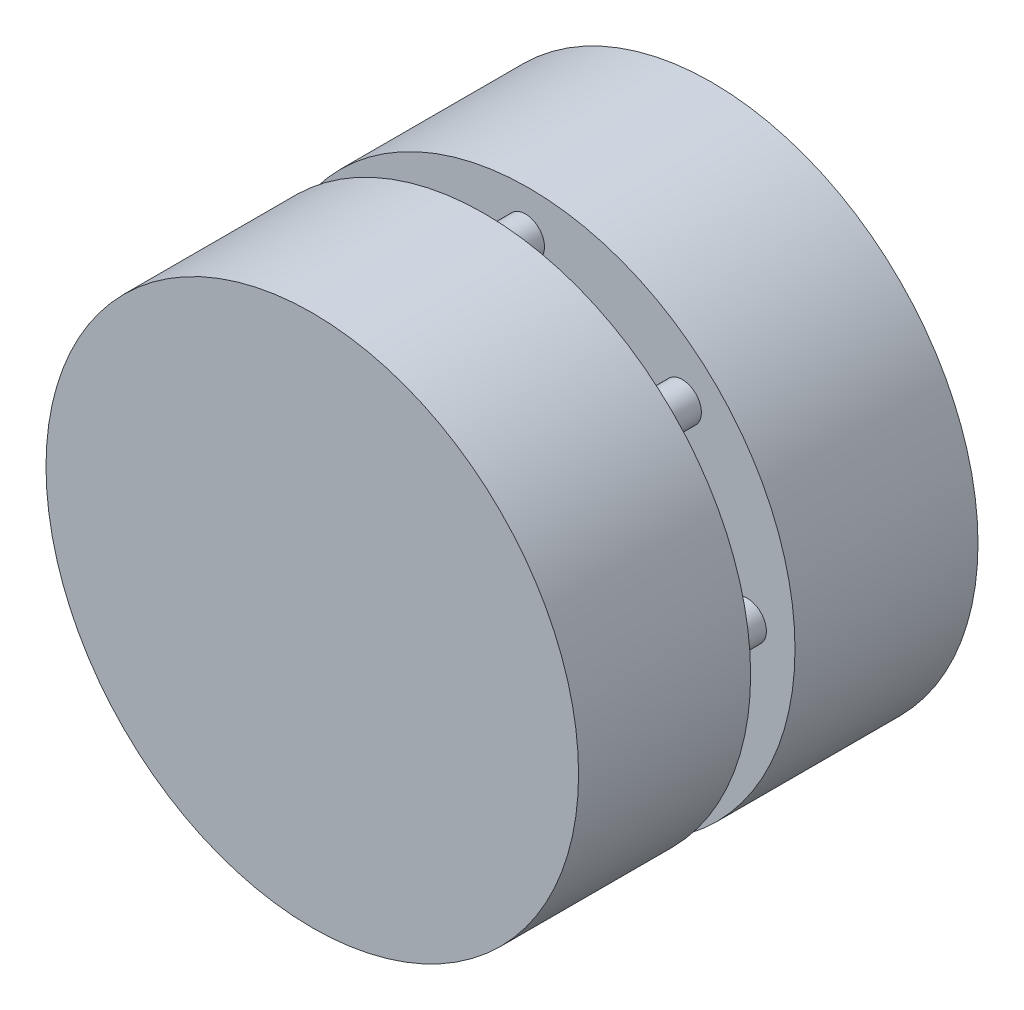
ISO-10303-21;
HEADER;
FILE_DESCRIPTION(('STEP AP214'),'2;1');
FILE_NAME('part.step','',(''),(''),'','','');
FILE_SCHEMA(('AUTOMOTIVE_DESIGN { 1 0 10303 214 1 1 1 1 }'));
ENDSEC;
DATA;
#1=APPLICATION_CONTEXT('core data for automotive mechanical design processes');
#2=APPLICATION_PROTOCOL_DEFINITION('international standard','automotive_design',2000,#1);
#3=PRODUCT_CONTEXT('',#1,'mechanical');
#4=PRODUCT('Part','Part','',(#3));
#5=PRODUCT_RELATED_PRODUCT_CATEGORY('part','',(#4));
#6=PRODUCT_DEFINITION_FORMATION('','',#4);
#7=PRODUCT_DEFINITION_CONTEXT('part definition',#1,'design');
#8=PRODUCT_DEFINITION('design','',#6,#7);
#9=PRODUCT_DEFINITION_SHAPE('','',#8);
#10=(LENGTH_UNIT() NAMED_UNIT(*) SI_UNIT(.MILLI.,.METRE.));
#11=(NAMED_UNIT(*) PLANE_ANGLE_UNIT() SI_UNIT($,.RADIAN.));
#12=(NAMED_UNIT(*) SI_UNIT($,.STERADIAN.) SOLID_ANGLE_UNIT());
#13=UNCERTAINTY_MEASURE_WITH_UNIT(LENGTH_MEASURE(1.E-05),#10,'distance_accuracy_value','');
#14=(GEOMETRIC_REPRESENTATION_CONTEXT(3) GLOBAL_UNCERTAINTY_ASSIGNED_CONTEXT((#13)) GLOBAL_UNIT_ASSIGNED_CONTEXT((#10,
#11,#12)) REPRESENTATION_CONTEXT('',''));
#15=CARTESIAN_POINT('',(0.,0.,0.));
#16=DIRECTION('',(0.,0.,1.));
#17=DIRECTION('',(1.,0.,0.));
#18=AXIS2_PLACEMENT_3D('',#15,#16,#17);
#19=CARTESIAN_POINT('',(0.371495889634384,-0.127231850121227,-23.8758825257781));
#20=DIRECTION('',(0.,0.,-1.));
#21=DIRECTION('',(-1.,0.,0.));
#22=AXIS2_PLACEMENT_3D('',#19,#20,#21);
#23=CYLINDRICAL_SURFACE('',#22,30.);
#24=CARTESIAN_POINT('',(0.371495889634384,-0.127231850121227,-48.2587693794276));
#25=DIRECTION('',(0.,0.,-1.));
#26=DIRECTION('',(-1.,0.,0.));
#27=AXIS2_PLACEMENT_3D('',#24,#25,#26);
#28=CIRCLE('',#27,30.);
#29=CARTESIAN_POINT('',(-29.6285041103656,-0.127231850121227,-48.2587693794276));
#30=VERTEX_POINT('',#29);
#31=EDGE_CURVE('E46',#30,#30,#28,.T.);
#32=CARTESIAN_POINT('',(0.371495889634384,-0.127231850121227,-68.8758825257781));
#33=DIRECTION('',(0.,0.,1.));
#34=DIRECTION('',(1.,0.,0.));
#35=AXIS2_PLACEMENT_3D('',#32,#33,#34);
#36=CIRCLE('',#35,30.);
#37=CARTESIAN_POINT('',(-29.6285041103656,-0.127231850121227,-68.8758825257781));
#38=VERTEX_POINT('',#37);
#39=EDGE_CURVE('E53',#38,#38,#36,.T.);
#40=CARTESIAN_POINT('',(-29.6285041103656,-0.127231850121227,-48.2587693794276));
#41=CARTESIAN_POINT('',(-29.6285041103656,-0.127231850121227,-48.4735309747021));
#42=CARTESIAN_POINT('',(-29.6285041103656,-0.127231850121227,-48.6882925699766));
#43=CARTESIAN_POINT('',(-29.6285041103656,-0.127231850121227,-49.1178157605255));
#44=CARTESIAN_POINT('',(-29.6285041103656,-0.127231850121227,-49.3325773558));
#45=CARTESIAN_POINT('',(-29.6285041103656,-0.127231850121227,-49.762100546349));
#46=CARTESIAN_POINT('',(-29.6285041103656,-0.127231850121227,-49.9768621416235));
#47=CARTESIAN_POINT('',(-29.6285041103656,-0.127231850121227,-50.4063853321724));
#48=CARTESIAN_POINT('',(-29.6285041103656,-0.127231850121227,-50.6211469274469));
#49=CARTESIAN_POINT('',(-29.6285041103656,-0.127231850121227,-51.0506701179959));
#50=CARTESIAN_POINT('',(-29.6285041103656,-0.127231850121227,-51.2654317132704));
#51=CARTESIAN_POINT('',(-29.6285041103656,-0.127231850121227,-51.6949549038194));
#52=CARTESIAN_POINT('',(-29.6285041103656,-0.127231850121227,-51.9097164990938));
#53=CARTESIAN_POINT('',(-29.6285041103656,-0.127231850121227,-52.3392396896428));
#54=CARTESIAN_POINT('',(-29.6285041103656,-0.127231850121227,-52.5540012849173));
#55=CARTESIAN_POINT('',(-29.6285041103656,-0.127231850121227,-52.9835244754663));
#56=CARTESIAN_POINT('',(-29.6285041103656,-0.127231850121227,-53.1982860707407));
#57=CARTESIAN_POINT('',(-29.6285041103656,-0.127231850121227,-53.6278092612897));
#58=CARTESIAN_POINT('',(-29.6285041103656,-0.127231850121227,-53.8425708565642));
#59=CARTESIAN_POINT('',(-29.6285041103656,-0.127231850121227,-54.2720940471132));
#60=CARTESIAN_POINT('',(-29.6285041103656,-0.127231850121227,-54.4868556423877));
#61=CARTESIAN_POINT('',(-29.6285041103656,-0.127231850121227,-54.9163788329366));
#62=CARTESIAN_POINT('',(-29.6285041103656,-0.127231850121227,-55.1311404282111));
#63=CARTESIAN_POINT('',(-29.6285041103656,-0.127231850121227,-55.5606636187601));
#64=CARTESIAN_POINT('',(-29.6285041103656,-0.127231850121227,-55.7754252140346));
#65=CARTESIAN_POINT('',(-29.6285041103656,-0.127231850121227,-56.2049484045835));
#66=CARTESIAN_POINT('',(-29.6285041103656,-0.127231850121227,-56.419709999858));
#67=CARTESIAN_POINT('',(-29.6285041103656,-0.127231850121227,-56.849233190407));
#68=CARTESIAN_POINT('',(-29.6285041103656,-0.127231850121227,-57.0639947856815));
#69=CARTESIAN_POINT('',(-29.6285041103656,-0.127231850121227,-57.4935179762304));
#70=CARTESIAN_POINT('',(-29.6285041103656,-0.127231850121227,-57.7082795715049));
#71=CARTESIAN_POINT('',(-29.6285041103656,-0.127231850121227,-58.1378027620539));
#72=CARTESIAN_POINT('',(-29.6285041103656,-0.127231850121227,-58.3525643573284));
#73=CARTESIAN_POINT('',(-29.6285041103656,-0.127231850121227,-58.7820875478774));
#74=CARTESIAN_POINT('',(-29.6285041103656,-0.127231850121227,-58.9968491431518));
#75=CARTESIAN_POINT('',(-29.6285041103656,-0.127231850121227,-59.4263723337008));
#76=CARTESIAN_POINT('',(-29.6285041103656,-0.127231850121227,-59.6411339289753));
#77=CARTESIAN_POINT('',(-29.6285041103656,-0.127231850121227,-60.0706571195243));
#78=CARTESIAN_POINT('',(-29.6285041103656,-0.127231850121227,-60.2854187147988));
#79=CARTESIAN_POINT('',(-29.6285041103656,-0.127231850121227,-60.7149419053477));
#80=CARTESIAN_POINT('',(-29.6285041103656,-0.127231850121227,-60.9297035006222));
#81=CARTESIAN_POINT('',(-29.6285041103656,-0.127231850121227,-61.3592266911712));
#82=CARTESIAN_POINT('',(-29.6285041103656,-0.127231850121227,-61.5739882864457));
#83=CARTESIAN_POINT('',(-29.6285041103656,-0.127231850121227,-62.0035114769946));
#84=CARTESIAN_POINT('',(-29.6285041103656,-0.127231850121227,-62.2182730722691));
#85=CARTESIAN_POINT('',(-29.6285041103656,-0.127231850121227,-62.6477962628181));
#86=CARTESIAN_POINT('',(-29.6285041103656,-0.127231850121227,-62.8625578580926));
#87=CARTESIAN_POINT('',(-29.6285041103656,-0.127231850121227,-63.2920810486415));
#88=CARTESIAN_POINT('',(-29.6285041103656,-0.127231850121227,-63.506842643916));
#89=CARTESIAN_POINT('',(-29.6285041103656,-0.127231850121227,-63.936365834465));
#90=CARTESIAN_POINT('',(-29.6285041103656,-0.127231850121227,-64.1511274297395));
#91=CARTESIAN_POINT('',(-29.6285041103656,-0.127231850121227,-64.5806506202885));
#92=CARTESIAN_POINT('',(-29.6285041103656,-0.127231850121227,-64.7954122155629));
#93=CARTESIAN_POINT('',(-29.6285041103656,-0.127231850121227,-65.2249354061119));
#94=CARTESIAN_POINT('',(-29.6285041103656,-0.127231850121227,-65.4396970013864));
#95=CARTESIAN_POINT('',(-29.6285041103656,-0.127231850121227,-65.8692201919354));
#96=CARTESIAN_POINT('',(-29.6285041103656,-0.127231850121227,-66.0839817872099));
#97=CARTESIAN_POINT('',(-29.6285041103656,-0.127231850121227,-66.5135049777588));
#98=CARTESIAN_POINT('',(-29.6285041103656,-0.127231850121227,-66.7282665730333));
#99=CARTESIAN_POINT('',(-29.6285041103656,-0.127231850121227,-67.1577897635823));
#100=CARTESIAN_POINT('',(-29.6285041103656,-0.127231850121227,-67.3725513588568));
#101=CARTESIAN_POINT('',(-29.6285041103656,-0.127231850121227,-67.8020745494057));
#102=CARTESIAN_POINT('',(-29.6285041103656,-0.127231850121227,-68.0168361446802));
#103=CARTESIAN_POINT('',(-29.6285041103656,-0.127231850121227,-68.4463593352292));
#104=CARTESIAN_POINT('',(-29.6285041103656,-0.127231850121227,-68.6611209305037));
#105=CARTESIAN_POINT('',(-29.6285041103656,-0.127231850121227,-68.8758825257781));
#106=B_SPLINE_CURVE_WITH_KNOTS('',3,(#40,#41,#42,#43,#44,#45,#46,#47,#48,#49,#50,#51,#52,#53,
#54,#55,#56,#57,#58,#59,#60,#61,#62,#63,#64,#65,#66,#67,#68,#69,#70,#71,#72,#73,#74,#75,#76,#77,
#78,#79,#80,#81,#82,#83,#84,#85,#86,#87,#88,#89,#90,#91,#92,#93,#94,#95,#96,#97,#98,#99,#100,
#101,#102,#103,#104,#105),.UNSPECIFIED.,.F.,.F.,(4,2,2,2,2,2,2,2,2,2,2,2,2,2,2,2,2,2,2,2,2,2,2,
2,2,2,2,2,2,2,2,2,4),(0.,0.644284785823457,1.28856957164691,1.93285435747037,2.57713914329383,
3.22142392911728,3.86570871494073,4.50999350076418,5.15427828658764,5.7985630724111,
6.44284785823455,7.087132644058,7.73141742988146,8.37570221570491,9.01998700152837,
9.66427178735182,10.3085565731753,10.9528413589987,11.5971261448222,12.2414109306456,
12.8856957164691,13.5299805022926,14.174265288116,14.8185500739395,15.4628348597629,
16.1071196455864,16.7514044314098,17.3956892172333,18.0399740030567,18.6842587888802,
19.3285435747036,19.9728283605271,20.6171131463505),.UNSPECIFIED.);
#107=EDGE_CURVE('BSEAM42',#30,#38,#106,.T.);
#108=ORIENTED_EDGE('',*,*,#31,.T.);
#109=ORIENTED_EDGE('',*,*,#39,.T.);
#110=ORIENTED_EDGE('',*,*,#107,.T.);
#111=ORIENTED_EDGE('',*,*,#107,.F.);
#112=EDGE_LOOP('',(#108,#110,#109,#111));
#113=FACE_BOUND('',#112,.T.);
#114=ADVANCED_FACE('F42',(#113),#23,.T.);
#115=CARTESIAN_POINT('',(0.371495889634384,-0.127231850121227,-68.8758825257781));
#116=DIRECTION('',(0.,0.,1.));
#117=DIRECTION('',(1.,0.,0.));
#118=AXIS2_PLACEMENT_3D('',#115,#116,#117);
#119=PLANE('',#118);
#120=ORIENTED_EDGE('',*,*,#39,.F.);
#121=EDGE_LOOP('',(#120));
#122=FACE_BOUND('',#121,.T.);
#123=ADVANCED_FACE('F194',(#122),#119,.F.);
#124=CARTESIAN_POINT('',(-42.15,-19.7589338943235,-48.2587693794276));
#125=DIRECTION('',(0.,0.,-1.));
#126=DIRECTION('',(0.,-1.,0.));
#127=AXIS2_PLACEMENT_3D('',#124,#125,#126);
#128=PLANE('',#127);
#129=CARTESIAN_POINT('',(0.,0.,-48.2587693794276));
#130=DIRECTION('',(0.,0.,-1.));
#131=DIRECTION('',(-1.,0.,0.));
#132=AXIS2_PLACEMENT_3D('',#129,#130,#131);
#133=CIRCLE('',#132,20.);
#134=CARTESIAN_POINT('',(-20.,0.,-48.2587693794276));
#135=VERTEX_POINT('',#134);
#136=EDGE_CURVE('E155',#135,#135,#133,.T.);
#137=ORIENTED_EDGE('',*,*,#136,.T.);
#138=EDGE_LOOP('',(#137));
#139=FACE_BOUND('',#138,.T.);
#140=CARTESIAN_POINT('',(0.,-25.,-48.2587693794276));
#141=DIRECTION('',(0.,0.,-1.));
#142=DIRECTION('',(-1.,0.,0.));
#143=AXIS2_PLACEMENT_3D('',#140,#141,#142);
#144=CIRCLE('',#143,2.15);
#145=CARTESIAN_POINT('',(-2.15,-25.,-48.2587693794276));
#146=VERTEX_POINT('',#145);
#147=EDGE_CURVE('E146',#146,#146,#144,.T.);
#148=ORIENTED_EDGE('',*,*,#147,.T.);
#149=EDGE_LOOP('',(#148));
#150=FACE_BOUND('',#149,.T.);
#151=CARTESIAN_POINT('',(-17.6776695296637,-17.6776695296637,-48.2587693794276));
#152=DIRECTION('',(0.,0.,-1.));
#153=DIRECTION('',(-1.,0.,0.));
#154=AXIS2_PLACEMENT_3D('',#151,#152,#153);
#155=CIRCLE('',#154,2.15);
#156=CARTESIAN_POINT('',(-19.8276695296637,-17.6776695296637,-48.2587693794276));
#157=VERTEX_POINT('',#156);
#158=EDGE_CURVE('E142',#157,#157,#155,.T.);
#159=ORIENTED_EDGE('',*,*,#158,.T.);
#160=EDGE_LOOP('',(#159));
#161=FACE_BOUND('',#160,.T.);
#162=CARTESIAN_POINT('',(-25.,0.,-48.2587693794276));
#163=DIRECTION('',(0.,0.,-1.));
#164=DIRECTION('',(-1.,0.,0.));
#165=AXIS2_PLACEMENT_3D('',#162,#163,#164);
#166=CIRCLE('',#165,2.15);
#167=CARTESIAN_POINT('',(-27.15,0.,-48.2587693794276));
#168=VERTEX_POINT('',#167);
#169=EDGE_CURVE('E145',#168,#168,#166,.T.);
#170=ORIENTED_EDGE('',*,*,#169,.T.);
#171=EDGE_LOOP('',(#170));
#172=FACE_BOUND('',#171,.T.);
#173=CARTESIAN_POINT('',(-17.6776695296637,17.6776695296637,-48.2587693794276));
#174=DIRECTION('',(0.,0.,-1.));
#175=DIRECTION('',(-1.,0.,0.));
#176=AXIS2_PLACEMENT_3D('',#173,#174,#175);
#177=CIRCLE('',#176,2.15);
#178=CARTESIAN_POINT('',(-19.8276695296637,17.6776695296637,-48.2587693794276));
#179=VERTEX_POINT('',#178);
#180=EDGE_CURVE('E150',#179,#179,#177,.T.);
#181=ORIENTED_EDGE('',*,*,#180,.T.);
#182=EDGE_LOOP('',(#181));
#183=FACE_BOUND('',#182,.T.);
#184=CARTESIAN_POINT('',(0.,25.,-48.2587693794276));
#185=DIRECTION('',(0.,0.,-1.));
#186=DIRECTION('',(-1.,0.,0.));
#187=AXIS2_PLACEMENT_3D('',#184,#185,#186);
#188=CIRCLE('',#187,2.15);
#189=CARTESIAN_POINT('',(-2.15,25.,-48.2587693794276));
#190=VERTEX_POINT('',#189);
#191=EDGE_CURVE('E159',#190,#190,#188,.T.);
#192=ORIENTED_EDGE('',*,*,#191,.T.);
#193=EDGE_LOOP('',(#192));
#194=FACE_BOUND('',#193,.T.);
#195=CARTESIAN_POINT('',(17.6776695296637,17.6776695296637,-48.2587693794276));
#196=DIRECTION('',(0.,0.,-1.));
#197=DIRECTION('',(-1.,0.,0.));
#198=AXIS2_PLACEMENT_3D('',#195,#196,#197);
#199=CIRCLE('',#198,2.15);
#200=CARTESIAN_POINT('',(15.5276695296637,17.6776695296637,-48.2587693794276));
#201=VERTEX_POINT('',#200);
#202=EDGE_CURVE('E161',#201,#201,#199,.T.);
#203=ORIENTED_EDGE('',*,*,#202,.T.);
#204=EDGE_LOOP('',(#203));
#205=FACE_BOUND('',#204,.T.);
#206=CARTESIAN_POINT('',(25.,0.,-48.2587693794276));
#207=DIRECTION('',(0.,0.,-1.));
#208=DIRECTION('',(-1.,0.,0.));
#209=AXIS2_PLACEMENT_3D('',#206,#207,#208);
#210=CIRCLE('',#209,2.15);
#211=CARTESIAN_POINT('',(22.85,0.,-48.2587693794276));
#212=VERTEX_POINT('',#211);
#213=EDGE_CURVE('E135',#212,#212,#210,.T.);
#214=ORIENTED_EDGE('',*,*,#213,.T.);
#215=EDGE_LOOP('',(#214));
#216=FACE_BOUND('',#215,.T.);
#217=CARTESIAN_POINT('',(17.6776695296637,-17.6776695296637,-48.2587693794276));
#218=DIRECTION('',(0.,0.,-1.));
#219=DIRECTION('',(-1.,0.,0.));
#220=AXIS2_PLACEMENT_3D('',#217,#218,#219);
#221=CIRCLE('',#220,2.15);
#222=CARTESIAN_POINT('',(15.5276695296637,-17.6776695296637,-48.2587693794276));
#223=VERTEX_POINT('',#222);
#224=EDGE_CURVE('E154',#223,#223,#221,.T.);
#225=ORIENTED_EDGE('',*,*,#224,.T.);
#226=EDGE_LOOP('',(#225));
#227=FACE_BOUND('',#226,.T.);
#228=ORIENTED_EDGE('',*,*,#31,.F.);
#229=EDGE_LOOP('',(#228));
#230=FACE_BOUND('',#229,.T.);
#231=ADVANCED_FACE('F191',(#139,#150,#161,#172,#183,#194,#205,#216,#227,#230),#128,.F.);
#232=CARTESIAN_POINT('',(-42.15,7.69572427943987,-43.2587693794276));
#233=DIRECTION('',(0.,0.,1.));
#234=DIRECTION('',(1.,0.,0.));
#235=AXIS2_PLACEMENT_3D('',#232,#233,#234);
#236=PLANE('',#235);
#237=CARTESIAN_POINT('',(0.,0.,-43.2587693794276));
#238=DIRECTION('',(0.,0.,-1.));
#239=DIRECTION('',(1.,0.,0.));
#240=AXIS2_PLACEMENT_3D('',#237,#238,#239);
#241=CIRCLE('',#240,20.5);
#242=CARTESIAN_POINT('',(20.5,0.,-43.2587693794276));
#243=VERTEX_POINT('',#242);
#244=EDGE_CURVE('E131',#243,#243,#241,.T.);
#245=ORIENTED_EDGE('',*,*,#244,.F.);
#246=EDGE_LOOP('',(#245));
#247=FACE_BOUND('',#246,.T.);
#248=CARTESIAN_POINT('',(17.6776695296637,-17.6776695296637,-43.2587693794276));
#249=DIRECTION('',(0.,0.,-1.));
#250=DIRECTION('',(-1.,0.,0.));
#251=AXIS2_PLACEMENT_3D('',#248,#249,#250);
#252=CIRCLE('',#251,2.15);
#253=CARTESIAN_POINT('',(15.5276695296637,-17.6776695296637,-43.2587693794276));
#254=VERTEX_POINT('',#253);
#255=EDGE_CURVE('E124',#254,#254,#252,.T.);
#256=ORIENTED_EDGE('',*,*,#255,.F.);
#257=EDGE_LOOP('',(#256));
#258=FACE_BOUND('',#257,.T.);
#259=CARTESIAN_POINT('',(25.,0.,-43.2587693794276));
#260=DIRECTION('',(0.,0.,-1.));
#261=DIRECTION('',(-1.,0.,0.));
#262=AXIS2_PLACEMENT_3D('',#259,#260,#261);
#263=CIRCLE('',#262,2.15);
#264=CARTESIAN_POINT('',(22.85,0.,-43.2587693794276));
#265=VERTEX_POINT('',#264);
#266=EDGE_CURVE('E119',#265,#265,#263,.T.);
#267=ORIENTED_EDGE('',*,*,#266,.F.);
#268=EDGE_LOOP('',(#267));
#269=FACE_BOUND('',#268,.T.);
#270=CARTESIAN_POINT('',(17.6776695296637,17.6776695296637,-43.2587693794276));
#271=DIRECTION('',(0.,0.,-1.));
#272=DIRECTION('',(-1.,0.,0.));
#273=AXIS2_PLACEMENT_3D('',#270,#271,#272);
#274=CIRCLE('',#273,2.15);
#275=CARTESIAN_POINT('',(15.5276695296637,17.6776695296637,-43.2587693794276));
#276=VERTEX_POINT('',#275);
#277=EDGE_CURVE('E123',#276,#276,#274,.T.);
#278=ORIENTED_EDGE('',*,*,#277,.F.);
#279=EDGE_LOOP('',(#278));
#280=FACE_BOUND('',#279,.T.);
#281=CARTESIAN_POINT('',(0.,25.,-43.2587693794276));
#282=DIRECTION('',(0.,0.,-1.));
#283=DIRECTION('',(-1.,0.,0.));
#284=AXIS2_PLACEMENT_3D('',#281,#282,#283);
#285=CIRCLE('',#284,2.15);
#286=CARTESIAN_POINT('',(-2.15,25.,-43.2587693794276));
#287=VERTEX_POINT('',#286);
#288=EDGE_CURVE('E129',#287,#287,#285,.T.);
#289=ORIENTED_EDGE('',*,*,#288,.F.);
#290=EDGE_LOOP('',(#289));
#291=FACE_BOUND('',#290,.T.);
#292=CARTESIAN_POINT('',(-17.6776695296637,17.6776695296637,-43.2587693794276));
#293=DIRECTION('',(0.,0.,-1.));
#294=DIRECTION('',(-1.,0.,0.));
#295=AXIS2_PLACEMENT_3D('',#292,#293,#294);
#296=CIRCLE('',#295,2.15);
#297=CARTESIAN_POINT('',(-19.8276695296637,17.6776695296637,-43.2587693794276));
#298=VERTEX_POINT('',#297);
#299=EDGE_CURVE('E137',#298,#298,#296,.T.);
#300=ORIENTED_EDGE('',*,*,#299,.F.);
#301=EDGE_LOOP('',(#300));
#302=FACE_BOUND('',#301,.T.);
#303=CARTESIAN_POINT('',(-25.,0.,-43.2587693794276));
#304=DIRECTION('',(0.,0.,-1.));
#305=DIRECTION('',(-1.,0.,0.));
#306=AXIS2_PLACEMENT_3D('',#303,#304,#305);
#307=CIRCLE('',#306,2.15);
#308=CARTESIAN_POINT('',(-27.15,0.,-43.2587693794276));
#309=VERTEX_POINT('',#308);
#310=EDGE_CURVE('E141',#309,#309,#307,.T.);
#311=ORIENTED_EDGE('',*,*,#310,.F.);
#312=EDGE_LOOP('',(#311));
#313=FACE_BOUND('',#312,.T.);
#314=CARTESIAN_POINT('',(-17.6776695296637,-17.6776695296637,-43.2587693794276));
#315=DIRECTION('',(0.,0.,-1.));
#316=DIRECTION('',(-1.,0.,0.));
#317=AXIS2_PLACEMENT_3D('',#314,#315,#316);
#318=CIRCLE('',#317,2.15);
#319=CARTESIAN_POINT('',(-19.8276695296637,-17.6776695296637,-43.2587693794276));
#320=VERTEX_POINT('',#319);
#321=EDGE_CURVE('E166',#320,#320,#318,.T.);
#322=ORIENTED_EDGE('',*,*,#321,.F.);
#323=EDGE_LOOP('',(#322));
#324=FACE_BOUND('',#323,.T.);
#325=CARTESIAN_POINT('',(0.,-25.,-43.2587693794276));
#326=DIRECTION('',(0.,0.,-1.));
#327=DIRECTION('',(-1.,0.,0.));
#328=AXIS2_PLACEMENT_3D('',#325,#326,#327);
#329=CIRCLE('',#328,2.15);
#330=CARTESIAN_POINT('',(-2.15,-25.,-43.2587693794276));
#331=VERTEX_POINT('',#330);
#332=EDGE_CURVE('E157',#331,#331,#329,.T.);
#333=ORIENTED_EDGE('',*,*,#332,.F.);
#334=EDGE_LOOP('',(#333));
#335=FACE_BOUND('',#334,.T.);
#336=CARTESIAN_POINT('',(0.371495889634384,-0.127231850121227,-43.2587693794276));
#337=DIRECTION('',(0.,0.,1.));
#338=DIRECTION('',(1.,0.,0.));
#339=AXIS2_PLACEMENT_3D('',#336,#337,#338);
#340=CIRCLE('',#339,30.);
#341=CARTESIAN_POINT('',(-29.6285041103656,-0.127231850121227,-43.2587693794276));
#342=VERTEX_POINT('',#341);
#343=EDGE_CURVE('E153',#342,#342,#340,.T.);
#344=ORIENTED_EDGE('',*,*,#343,.F.);
#345=EDGE_LOOP('',(#344));
#346=FACE_BOUND('',#345,.T.);
#347=ADVANCED_FACE('F193',(#247,#258,#269,#280,#291,#302,#313,#324,#335,#346),#236,.F.);
#348=CARTESIAN_POINT('',(0.,0.,-43.7587693794276));
#349=DIRECTION('',(0.,0.,1.));
#350=DIRECTION('',(1.,0.,0.));
#351=AXIS2_PLACEMENT_3D('',#348,#349,#350);
#352=TOROIDAL_SURFACE('',#351,20.5,0.5);
#353=ORIENTED_EDGE('',*,*,#244,.T.);
#354=EDGE_LOOP('',(#353));
#355=FACE_BOUND('',#354,.T.);
#356=CARTESIAN_POINT('',(0.,0.,-43.7587693794276));
#357=DIRECTION('',(0.,0.,1.));
#358=DIRECTION('',(1.,0.,0.));
#359=AXIS2_PLACEMENT_3D('',#356,#357,#358);
#360=CIRCLE('',#359,20.);
#361=CARTESIAN_POINT('',(20.,0.,-43.7587693794276));
#362=VERTEX_POINT('',#361);
#363=EDGE_CURVE('E64',#362,#362,#360,.T.);
#364=ORIENTED_EDGE('',*,*,#363,.T.);
#365=EDGE_LOOP('',(#364));
#366=FACE_BOUND('',#365,.T.);
#367=ADVANCED_FACE('F200',(#355,#366),#352,.F.);
#368=CARTESIAN_POINT('',(0.,0.,-43.2587693794276));
#369=DIRECTION('',(0.,0.,-1.));
#370=DIRECTION('',(-1.,0.,0.));
#371=AXIS2_PLACEMENT_3D('',#368,#369,#370);
#372=CYLINDRICAL_SURFACE('',#371,20.);
#373=ORIENTED_EDGE('',*,*,#136,.F.);
#374=EDGE_LOOP('',(#373));
#375=FACE_BOUND('',#374,.T.);
#376=ORIENTED_EDGE('',*,*,#363,.F.);
#377=EDGE_LOOP('',(#376));
#378=FACE_BOUND('',#377,.T.);
#379=ADVANCED_FACE('F236',(#375,#378),#372,.T.);
#380=CARTESIAN_POINT('',(17.6776695296637,-17.6776695296637,-43.2587693794276));
#381=DIRECTION('',(0.,0.,-1.));
#382=DIRECTION('',(-1.,0.,0.));
#383=AXIS2_PLACEMENT_3D('',#380,#381,#382);
#384=CYLINDRICAL_SURFACE('',#383,2.15);
#385=ORIENTED_EDGE('',*,*,#224,.F.);
#386=EDGE_LOOP('',(#385));
#387=FACE_BOUND('',#386,.T.);
#388=ORIENTED_EDGE('',*,*,#255,.T.);
#389=EDGE_LOOP('',(#388));
#390=FACE_BOUND('',#389,.T.);
#391=ADVANCED_FACE('F228',(#387,#390),#384,.T.);
#392=CARTESIAN_POINT('',(25.,0.,-43.2587693794276));
#393=DIRECTION('',(0.,0.,-1.));
#394=DIRECTION('',(-1.,0.,0.));
#395=AXIS2_PLACEMENT_3D('',#392,#393,#394);
#396=CYLINDRICAL_SURFACE('',#395,2.15);
#397=ORIENTED_EDGE('',*,*,#213,.F.);
#398=EDGE_LOOP('',(#397));
#399=FACE_BOUND('',#398,.T.);
#400=ORIENTED_EDGE('',*,*,#266,.T.);
#401=EDGE_LOOP('',(#400));
#402=FACE_BOUND('',#401,.T.);
#403=ADVANCED_FACE('F120',(#399,#402),#396,.T.);
#404=CARTESIAN_POINT('',(17.6776695296637,17.6776695296637,-43.2587693794276));
#405=DIRECTION('',(0.,0.,-1.));
#406=DIRECTION('',(-1.,0.,0.));
#407=AXIS2_PLACEMENT_3D('',#404,#405,#406);
#408=CYLINDRICAL_SURFACE('',#407,2.15);
#409=ORIENTED_EDGE('',*,*,#202,.F.);
#410=EDGE_LOOP('',(#409));
#411=FACE_BOUND('',#410,.T.);
#412=ORIENTED_EDGE('',*,*,#277,.T.);
#413=EDGE_LOOP('',(#412));
#414=FACE_BOUND('',#413,.T.);
#415=ADVANCED_FACE('F227',(#411,#414),#408,.T.);
#416=CARTESIAN_POINT('',(0.,25.,-43.2587693794276));
#417=DIRECTION('',(0.,0.,-1.));
#418=DIRECTION('',(-1.,0.,0.));
#419=AXIS2_PLACEMENT_3D('',#416,#417,#418);
#420=CYLINDRICAL_SURFACE('',#419,2.15);
#421=ORIENTED_EDGE('',*,*,#191,.F.);
#422=EDGE_LOOP('',(#421));
#423=FACE_BOUND('',#422,.T.);
#424=ORIENTED_EDGE('',*,*,#288,.T.);
#425=EDGE_LOOP('',(#424));
#426=FACE_BOUND('',#425,.T.);
#427=ADVANCED_FACE('F232',(#423,#426),#420,.T.);
#428=CARTESIAN_POINT('',(-17.6776695296637,17.6776695296637,-43.2587693794276));
#429=DIRECTION('',(0.,0.,-1.));
#430=DIRECTION('',(-1.,0.,0.));
#431=AXIS2_PLACEMENT_3D('',#428,#429,#430);
#432=CYLINDRICAL_SURFACE('',#431,2.15);
#433=ORIENTED_EDGE('',*,*,#180,.F.);
#434=EDGE_LOOP('',(#433));
#435=FACE_BOUND('',#434,.T.);
#436=ORIENTED_EDGE('',*,*,#299,.T.);
#437=EDGE_LOOP('',(#436));
#438=FACE_BOUND('',#437,.T.);
#439=ADVANCED_FACE('F242',(#435,#438),#432,.T.);
#440=CARTESIAN_POINT('',(-25.,0.,-43.2587693794276));
#441=DIRECTION('',(0.,0.,-1.));
#442=DIRECTION('',(-1.,0.,0.));
#443=AXIS2_PLACEMENT_3D('',#440,#441,#442);
#444=CYLINDRICAL_SURFACE('',#443,2.15);
#445=ORIENTED_EDGE('',*,*,#169,.F.);
#446=EDGE_LOOP('',(#445));
#447=FACE_BOUND('',#446,.T.);
#448=ORIENTED_EDGE('',*,*,#310,.T.);
#449=EDGE_LOOP('',(#448));
#450=FACE_BOUND('',#449,.T.);
#451=ADVANCED_FACE('F240',(#447,#450),#444,.T.);
#452=CARTESIAN_POINT('',(-17.6776695296637,-17.6776695296637,-43.2587693794276));
#453=DIRECTION('',(0.,0.,-1.));
#454=DIRECTION('',(-1.,0.,0.));
#455=AXIS2_PLACEMENT_3D('',#452,#453,#454);
#456=CYLINDRICAL_SURFACE('',#455,2.15);
#457=ORIENTED_EDGE('',*,*,#158,.F.);
#458=EDGE_LOOP('',(#457));
#459=FACE_BOUND('',#458,.T.);
#460=ORIENTED_EDGE('',*,*,#321,.T.);
#461=EDGE_LOOP('',(#460));
#462=FACE_BOUND('',#461,.T.);
#463=ADVANCED_FACE('F221',(#459,#462),#456,.T.);
#464=CARTESIAN_POINT('',(0.,-25.,-43.2587693794276));
#465=DIRECTION('',(0.,0.,-1.));
#466=DIRECTION('',(-1.,0.,0.));
#467=AXIS2_PLACEMENT_3D('',#464,#465,#466);
#468=CYLINDRICAL_SURFACE('',#467,2.15);
#469=ORIENTED_EDGE('',*,*,#147,.F.);
#470=EDGE_LOOP('',(#469));
#471=FACE_BOUND('',#470,.T.);
#472=ORIENTED_EDGE('',*,*,#332,.T.);
#473=EDGE_LOOP('',(#472));
#474=FACE_BOUND('',#473,.T.);
#475=ADVANCED_FACE('F214',(#471,#474),#468,.T.);
#476=CARTESIAN_POINT('',(0.371495889634384,-0.127231850121227,-23.8758825257781));
#477=DIRECTION('',(0.,0.,1.));
#478=DIRECTION('',(1.,0.,0.));
#479=AXIS2_PLACEMENT_3D('',#476,#477,#478);
#480=PLANE('',#479);
#481=CARTESIAN_POINT('',(0.371495889634384,-0.127231850121227,-23.8758825257781));
#482=DIRECTION('',(0.,0.,1.));
#483=DIRECTION('',(1.,0.,0.));
#484=AXIS2_PLACEMENT_3D('',#481,#482,#483);
#485=CIRCLE('',#484,30.);
#486=CARTESIAN_POINT('',(-29.6285041103656,-0.127231850121227,-23.8758825257781));
#487=VERTEX_POINT('',#486);
#488=EDGE_CURVE('E11',#487,#487,#485,.T.);
#489=ORIENTED_EDGE('',*,*,#488,.T.);
#490=EDGE_LOOP('',(#489));
#491=FACE_BOUND('',#490,.T.);
#492=ADVANCED_FACE('F210',(#491),#480,.T.);
#493=CARTESIAN_POINT('',(-29.6285041103656,-0.127231850121227,-43.2587693794276));
#494=CARTESIAN_POINT('',(-29.6285041103656,-0.127231850121227,-43.0568643080354));
#495=CARTESIAN_POINT('',(-29.6285041103656,-0.127231850121227,-42.8549592366432));
#496=CARTESIAN_POINT('',(-29.6285041103656,-0.127231850121227,-42.4511490938589));
#497=CARTESIAN_POINT('',(-29.6285041103656,-0.127231850121227,-42.2492440224667));
#498=CARTESIAN_POINT('',(-29.6285041103656,-0.127231850121227,-41.8454338796823));
#499=CARTESIAN_POINT('',(-29.6285041103656,-0.127231850121227,-41.6435288082901));
#500=CARTESIAN_POINT('',(-29.6285041103656,-0.127231850121227,-41.2397186655058));
#501=CARTESIAN_POINT('',(-29.6285041103656,-0.127231850121227,-41.0378135941136));
#502=CARTESIAN_POINT('',(-29.6285041103656,-0.127231850121227,-40.6340034513292));
#503=CARTESIAN_POINT('',(-29.6285041103656,-0.127231850121227,-40.4320983799371));
#504=CARTESIAN_POINT('',(-29.6285041103656,-0.127231850121227,-40.0282882371527));
#505=CARTESIAN_POINT('',(-29.6285041103656,-0.127231850121227,-39.8263831657605));
#506=CARTESIAN_POINT('',(-29.6285041103656,-0.127231850121227,-39.4225730229762));
#507=CARTESIAN_POINT('',(-29.6285041103656,-0.127231850121227,-39.220667951584));
#508=CARTESIAN_POINT('',(-29.6285041103656,-0.127231850121227,-38.8168578087996));
#509=CARTESIAN_POINT('',(-29.6285041103656,-0.127231850121227,-38.6149527374074));
#510=CARTESIAN_POINT('',(-29.6285041103656,-0.127231850121227,-38.2111425946231));
#511=CARTESIAN_POINT('',(-29.6285041103656,-0.127231850121227,-38.0092375232309));
#512=CARTESIAN_POINT('',(-29.6285041103656,-0.127231850121227,-37.6054273804465));
#513=CARTESIAN_POINT('',(-29.6285041103656,-0.127231850121227,-37.4035223090543));
#514=CARTESIAN_POINT('',(-29.6285041103656,-0.127231850121227,-36.99971216627));
#515=CARTESIAN_POINT('',(-29.6285041103656,-0.127231850121227,-36.7978070948778));
#516=CARTESIAN_POINT('',(-29.6285041103656,-0.127231850121227,-36.3939969520934));
#517=CARTESIAN_POINT('',(-29.6285041103656,-0.127231850121227,-36.1920918807012));
#518=CARTESIAN_POINT('',(-29.6285041103656,-0.127231850121227,-35.7882817379169));
#519=CARTESIAN_POINT('',(-29.6285041103656,-0.127231850121227,-35.5863766665247));
#520=CARTESIAN_POINT('',(-29.6285041103656,-0.127231850121227,-35.1825665237403));
#521=CARTESIAN_POINT('',(-29.6285041103656,-0.127231850121227,-34.9806614523482));
#522=CARTESIAN_POINT('',(-29.6285041103656,-0.127231850121227,-34.5768513095638));
#523=CARTESIAN_POINT('',(-29.6285041103656,-0.127231850121227,-34.3749462381716));
#524=CARTESIAN_POINT('',(-29.6285041103656,-0.127231850121227,-33.9711360953872));
#525=CARTESIAN_POINT('',(-29.6285041103656,-0.127231850121227,-33.7692310239951));
#526=CARTESIAN_POINT('',(-29.6285041103656,-0.127231850121227,-33.3654208812107));
#527=CARTESIAN_POINT('',(-29.6285041103656,-0.127231850121227,-33.1635158098185));
#528=CARTESIAN_POINT('',(-29.6285041103656,-0.127231850121227,-32.7597056670341));
#529=CARTESIAN_POINT('',(-29.6285041103656,-0.127231850121227,-32.557800595642));
#530=CARTESIAN_POINT('',(-29.6285041103656,-0.127231850121227,-32.1539904528576));
#531=CARTESIAN_POINT('',(-29.6285041103656,-0.127231850121227,-31.9520853814654));
#532=CARTESIAN_POINT('',(-29.6285041103656,-0.127231850121227,-31.5482752386811));
#533=CARTESIAN_POINT('',(-29.6285041103656,-0.127231850121227,-31.3463701672889));
#534=CARTESIAN_POINT('',(-29.6285041103656,-0.127231850121227,-30.9425600245045));
#535=CARTESIAN_POINT('',(-29.6285041103656,-0.127231850121227,-30.7406549531123));
#536=CARTESIAN_POINT('',(-29.6285041103656,-0.127231850121227,-30.336844810328));
#537=CARTESIAN_POINT('',(-29.6285041103656,-0.127231850121227,-30.1349397389358));
#538=CARTESIAN_POINT('',(-29.6285041103656,-0.127231850121227,-29.7311295961514));
#539=CARTESIAN_POINT('',(-29.6285041103656,-0.127231850121227,-29.5292245247592));
#540=CARTESIAN_POINT('',(-29.6285041103656,-0.127231850121227,-29.1254143819749));
#541=CARTESIAN_POINT('',(-29.6285041103656,-0.127231850121227,-28.9235093105827));
#542=CARTESIAN_POINT('',(-29.6285041103656,-0.127231850121227,-28.5196991677983));
#543=CARTESIAN_POINT('',(-29.6285041103656,-0.127231850121227,-28.3177940964061));
#544=CARTESIAN_POINT('',(-29.6285041103656,-0.127231850121227,-27.9139839536218));
#545=CARTESIAN_POINT('',(-29.6285041103656,-0.127231850121227,-27.7120788822296));
#546=CARTESIAN_POINT('',(-29.6285041103656,-0.127231850121227,-27.3082687394452));
#547=CARTESIAN_POINT('',(-29.6285041103656,-0.127231850121227,-27.1063636680531));
#548=CARTESIAN_POINT('',(-29.6285041103656,-0.127231850121227,-26.7025535252687));
#549=CARTESIAN_POINT('',(-29.6285041103656,-0.127231850121227,-26.5006484538765));
#550=CARTESIAN_POINT('',(-29.6285041103656,-0.127231850121227,-26.0968383110921));
#551=CARTESIAN_POINT('',(-29.6285041103656,-0.127231850121227,-25.8949332397));
#552=CARTESIAN_POINT('',(-29.6285041103656,-0.127231850121227,-25.4911230969156));
#553=CARTESIAN_POINT('',(-29.6285041103656,-0.127231850121227,-25.2892180255234));
#554=CARTESIAN_POINT('',(-29.6285041103656,-0.127231850121227,-24.8854078827391));
#555=CARTESIAN_POINT('',(-29.6285041103656,-0.127231850121227,-24.6835028113469));
#556=CARTESIAN_POINT('',(-29.6285041103656,-0.127231850121227,-24.2796926685625));
#557=CARTESIAN_POINT('',(-29.6285041103656,-0.127231850121227,-24.0777875971703));
#558=CARTESIAN_POINT('',(-29.6285041103656,-0.127231850121227,-23.8758825257781));
#559=B_SPLINE_CURVE_WITH_KNOTS('',3,(#493,#494,#495,#496,#497,#498,#499,#500,#501,#502,#503,
#504,#505,#506,#507,#508,#509,#510,#511,#512,#513,#514,#515,#516,#517,#518,#519,#520,#521,#522,
#523,#524,#525,#526,#527,#528,#529,#530,#531,#532,#533,#534,#535,#536,#537,#538,#539,#540,#541,
#542,#543,#544,#545,#546,#547,#548,#549,#550,#551,#552,#553,#554,#555,#556,#557,#558),
.UNSPECIFIED.,.F.,.F.,(4,2,2,2,2,2,2,2,2,2,2,2,2,2,2,2,2,2,2,2,2,2,2,2,2,2,2,2,2,2,2,2,4),(0.,
0.605715214176544,1.21143042835309,1.81714564252963,2.42286085670618,3.02857607088272,
3.63429128505927,4.24000649923582,4.84572171341236,5.45143692758891,6.05715214176545,
6.662867355942,7.26858257011855,7.87429778429509,8.48001299847163,9.08572821264818,
9.69144342682472,10.2971586410013,10.9028738551778,11.5085890693544,12.1143042835309,
12.7200194977075,13.325734711884,13.9314499260605,14.5371651402371,15.1428803544136,
15.7485955685902,16.3543107827667,16.9600259969433,17.5657412111198,18.1714564252964,
18.7771716394729,19.3828868536495),.UNSPECIFIED.);
#560=EDGE_CURVE('BSEAM44',#342,#487,#559,.T.);
#561=ORIENTED_EDGE('',*,*,#343,.T.);
#562=ORIENTED_EDGE('',*,*,#488,.F.);
#563=ORIENTED_EDGE('',*,*,#560,.T.);
#564=ORIENTED_EDGE('',*,*,#560,.F.);
#565=EDGE_LOOP('',(#561,#563,#562,#564));
#566=FACE_BOUND('',#565,.T.);
#567=ADVANCED_FACE('F44',(#566),#23,.T.);
#568=CLOSED_SHELL('',(#114,#123,#231,#347,#367,#379,#391,#403,#415,#427,#439,#451,#463,#475,
#492,#567));
#569=MANIFOLD_SOLID_BREP('B2',#568);
#570=ADVANCED_BREP_SHAPE_REPRESENTATION('',(#18,#569),#14);
#571=SHAPE_DEFINITION_REPRESENTATION(#9,#570);
ENDSEC;
END-ISO-10303-21;
